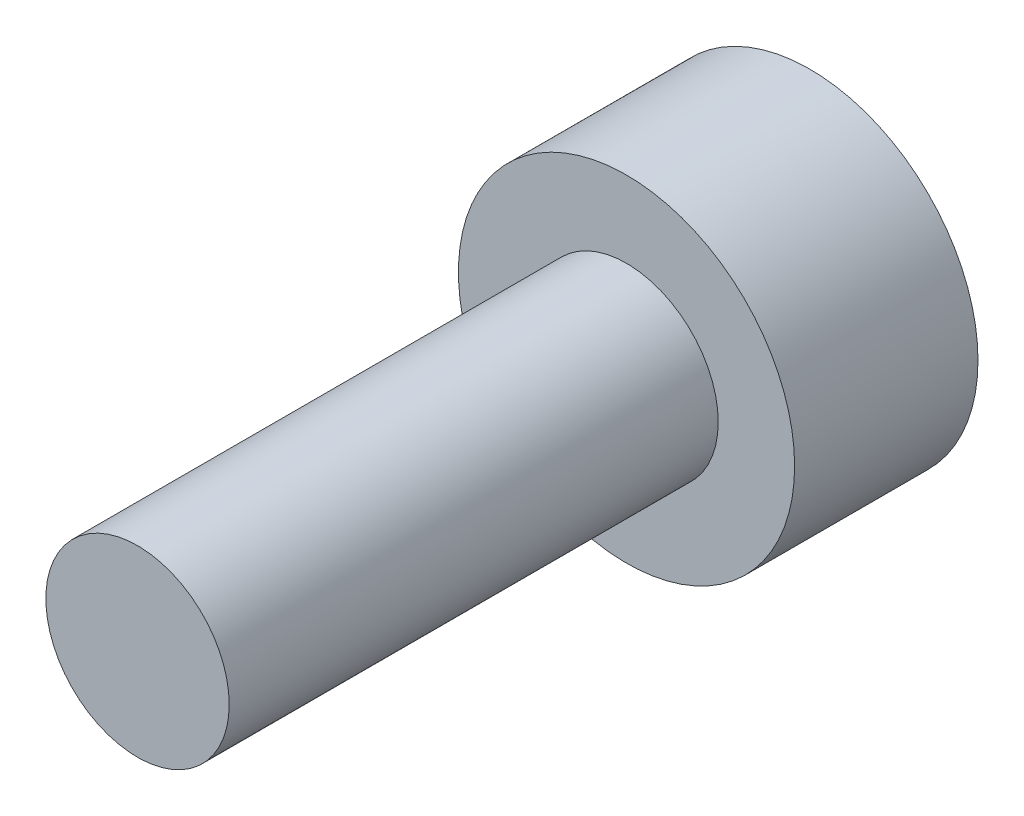
ISO-10303-21;
HEADER;
FILE_DESCRIPTION(('STEP AP214'),'2;1');
FILE_NAME('part.step','',(''),(''),'','','');
FILE_SCHEMA(('AUTOMOTIVE_DESIGN { 1 0 10303 214 1 1 1 1 }'));
ENDSEC;
DATA;
#1=APPLICATION_CONTEXT('core data for automotive mechanical design processes');
#2=APPLICATION_PROTOCOL_DEFINITION('international standard','automotive_design',2000,#1);
#3=PRODUCT_CONTEXT('',#1,'mechanical');
#4=PRODUCT('Part','Part','',(#3));
#5=PRODUCT_RELATED_PRODUCT_CATEGORY('part','',(#4));
#6=PRODUCT_DEFINITION_FORMATION('','',#4);
#7=PRODUCT_DEFINITION_CONTEXT('part definition',#1,'design');
#8=PRODUCT_DEFINITION('design','',#6,#7);
#9=PRODUCT_DEFINITION_SHAPE('','',#8);
#10=(LENGTH_UNIT() NAMED_UNIT(*) SI_UNIT(.MILLI.,.METRE.));
#11=(NAMED_UNIT(*) PLANE_ANGLE_UNIT() SI_UNIT($,.RADIAN.));
#12=(NAMED_UNIT(*) SI_UNIT($,.STERADIAN.) SOLID_ANGLE_UNIT());
#13=UNCERTAINTY_MEASURE_WITH_UNIT(LENGTH_MEASURE(1.E-05),#10,'distance_accuracy_value','');
#14=(GEOMETRIC_REPRESENTATION_CONTEXT(3) GLOBAL_UNCERTAINTY_ASSIGNED_CONTEXT((#13)) GLOBAL_UNIT_ASSIGNED_CONTEXT((#10,
#11,#12)) REPRESENTATION_CONTEXT('',''));
#15=CARTESIAN_POINT('',(0.,0.,0.));
#16=DIRECTION('',(0.,0.,1.));
#17=DIRECTION('',(1.,0.,0.));
#18=AXIS2_PLACEMENT_3D('',#15,#16,#17);
#19=CARTESIAN_POINT('',(0.,0.,3.));
#20=DIRECTION('',(0.,0.,1.));
#21=DIRECTION('',(1.,0.,0.));
#22=AXIS2_PLACEMENT_3D('',#19,#20,#21);
#23=PLANE('',#22);
#24=CARTESIAN_POINT('',(0.,0.,3.));
#25=DIRECTION('',(0.,0.,1.));
#26=DIRECTION('',(1.,0.,0.));
#27=AXIS2_PLACEMENT_3D('',#24,#25,#26);
#28=CIRCLE('',#27,2.75);
#29=CARTESIAN_POINT('',(2.75,0.,3.));
#30=VERTEX_POINT('',#29);
#31=EDGE_CURVE('E11',#30,#30,#28,.T.);
#32=ORIENTED_EDGE('',*,*,#31,.T.);
#33=EDGE_LOOP('',(#32));
#34=FACE_BOUND('',#33,.T.);
#35=CARTESIAN_POINT('',(0.,0.,3.));
#36=DIRECTION('',(0.,0.,1.));
#37=DIRECTION('',(1.,0.,0.));
#38=AXIS2_PLACEMENT_3D('',#35,#36,#37);
#39=CIRCLE('',#38,1.5);
#40=CARTESIAN_POINT('',(1.5,0.,3.));
#41=VERTEX_POINT('',#40);
#42=EDGE_CURVE('E139',#41,#41,#39,.T.);
#43=ORIENTED_EDGE('',*,*,#42,.F.);
#44=EDGE_LOOP('',(#43));
#45=FACE_BOUND('',#44,.T.);
#46=ADVANCED_FACE('F37',(#34,#45),#23,.T.);
#47=CARTESIAN_POINT('',(0.,0.,3.));
#48=DIRECTION('',(0.,0.,-1.));
#49=DIRECTION('',(-1.,0.,0.));
#50=AXIS2_PLACEMENT_3D('',#47,#48,#49);
#51=CYLINDRICAL_SURFACE('',#50,2.75);
#52=ORIENTED_EDGE('',*,*,#31,.F.);
#53=EDGE_LOOP('',(#52));
#54=FACE_BOUND('',#53,.T.);
#55=CARTESIAN_POINT('',(0.,0.,0.));
#56=DIRECTION('',(0.,0.,1.));
#57=DIRECTION('',(1.,0.,0.));
#58=AXIS2_PLACEMENT_3D('',#55,#56,#57);
#59=CIRCLE('',#58,2.75);
#60=CARTESIAN_POINT('',(2.75,0.,0.));
#61=VERTEX_POINT('',#60);
#62=EDGE_CURVE('E41',#61,#61,#59,.T.);
#63=ORIENTED_EDGE('',*,*,#62,.T.);
#64=EDGE_LOOP('',(#63));
#65=FACE_BOUND('',#64,.T.);
#66=ADVANCED_FACE('F39',(#54,#65),#51,.T.);
#67=CARTESIAN_POINT('',(0.,0.,0.));
#68=DIRECTION('',(0.,0.,1.));
#69=DIRECTION('',(1.,0.,0.));
#70=AXIS2_PLACEMENT_3D('',#67,#68,#69);
#71=PLANE('',#70);
#72=DIRECTION('',(0.284171427874139,0.958773487107342,0.));
#73=VECTOR('',#72,1.);
#74=CARTESIAN_POINT('',(-1.66357981000848,-0.399103763087742,0.));
#75=LINE('',#74,#73);
#76=CARTESIAN_POINT('',(-1.66357981000848,-0.399103763087742,0.));
#77=VERTEX_POINT('',#76);
#78=CARTESIAN_POINT('',(-1.17742390258419,1.24115049514637,0.));
#79=VERTEX_POINT('',#78);
#80=EDGE_CURVE('E126',#77,#79,#75,.T.);
#81=ORIENTED_EDGE('',*,*,#80,.F.);
#82=DIRECTION('',(-0.688236482372881,0.725486419122372,0.));
#83=VECTOR('',#82,1.);
#84=CARTESIAN_POINT('',(-0.48615590742429,-1.64025425823411,0.));
#85=LINE('',#84,#83);
#86=CARTESIAN_POINT('',(-0.48615590742429,-1.64025425823411,0.));
#87=VERTEX_POINT('',#86);
#88=EDGE_CURVE('E52',#87,#77,#85,.T.);
#89=ORIENTED_EDGE('',*,*,#88,.F.);
#90=DIRECTION('',(-0.97240791024702,-0.23328706798497,0.));
#91=VECTOR('',#90,1.);
#92=CARTESIAN_POINT('',(1.17742390258419,-1.24115049514637,0.));
#93=LINE('',#92,#91);
#94=CARTESIAN_POINT('',(1.17742390258419,-1.24115049514637,0.));
#95=VERTEX_POINT('',#94);
#96=EDGE_CURVE('E135',#95,#87,#93,.T.);
#97=ORIENTED_EDGE('',*,*,#96,.F.);
#98=DIRECTION('',(-0.284171427874138,-0.958773487107342,0.));
#99=VECTOR('',#98,1.);
#100=CARTESIAN_POINT('',(1.66357981000848,0.399103763087743,0.));
#101=LINE('',#100,#99);
#102=CARTESIAN_POINT('',(1.66357981000848,0.399103763087743,0.));
#103=VERTEX_POINT('',#102);
#104=EDGE_CURVE('E133',#103,#95,#101,.T.);
#105=ORIENTED_EDGE('',*,*,#104,.F.);
#106=DIRECTION('',(0.688236482372881,-0.725486419122372,0.));
#107=VECTOR('',#106,1.);
#108=CARTESIAN_POINT('',(0.486155907424292,1.64025425823411,0.));
#109=LINE('',#108,#107);
#110=CARTESIAN_POINT('',(0.486155907424292,1.64025425823411,0.));
#111=VERTEX_POINT('',#110);
#112=EDGE_CURVE('E100',#111,#103,#109,.T.);
#113=ORIENTED_EDGE('',*,*,#112,.F.);
#114=DIRECTION('',(0.97240791024702,0.23328706798497,0.));
#115=VECTOR('',#114,1.);
#116=CARTESIAN_POINT('',(-1.17742390258419,1.24115049514637,0.));
#117=LINE('',#116,#115);
#118=EDGE_CURVE('E129',#79,#111,#117,.T.);
#119=ORIENTED_EDGE('',*,*,#118,.F.);
#120=EDGE_LOOP('',(#81,#89,#97,#105,#113,#119));
#121=FACE_BOUND('',#120,.T.);
#122=ORIENTED_EDGE('',*,*,#62,.F.);
#123=EDGE_LOOP('',(#122));
#124=FACE_BOUND('',#123,.T.);
#125=ADVANCED_FACE('F159',(#121,#124),#71,.F.);
#126=CARTESIAN_POINT('',(0.,0.,11.));
#127=DIRECTION('',(0.,0.,-1.));
#128=DIRECTION('',(-1.,0.,0.));
#129=AXIS2_PLACEMENT_3D('',#126,#127,#128);
#130=CYLINDRICAL_SURFACE('',#129,1.5);
#131=CARTESIAN_POINT('',(0.,0.,11.));
#132=DIRECTION('',(0.,0.,1.));
#133=DIRECTION('',(1.,0.,0.));
#134=AXIS2_PLACEMENT_3D('',#131,#132,#133);
#135=CIRCLE('',#134,1.5);
#136=CARTESIAN_POINT('',(1.5,0.,11.));
#137=VERTEX_POINT('',#136);
#138=EDGE_CURVE('E145',#137,#137,#135,.T.);
#139=ORIENTED_EDGE('',*,*,#138,.F.);
#140=EDGE_LOOP('',(#139));
#141=FACE_BOUND('',#140,.T.);
#142=ORIENTED_EDGE('',*,*,#42,.T.);
#143=EDGE_LOOP('',(#142));
#144=FACE_BOUND('',#143,.T.);
#145=ADVANCED_FACE('F151',(#141,#144),#130,.T.);
#146=CARTESIAN_POINT('',(0.,0.,11.));
#147=DIRECTION('',(0.,0.,1.));
#148=DIRECTION('',(1.,0.,0.));
#149=AXIS2_PLACEMENT_3D('',#146,#147,#148);
#150=PLANE('',#149);
#151=ORIENTED_EDGE('',*,*,#138,.T.);
#152=EDGE_LOOP('',(#151));
#153=FACE_BOUND('',#152,.T.);
#154=ADVANCED_FACE('F168',(#153),#150,.T.);
#155=CARTESIAN_POINT('',(-0.48615590742429,-1.64025425823411,2.));
#156=DIRECTION('',(-0.725486419122372,-0.688236482372881,0.));
#157=DIRECTION('',(0.688236482372881,-0.725486419122372,0.));
#158=AXIS2_PLACEMENT_3D('',#155,#156,#157);
#159=PLANE('',#158);
#160=ORIENTED_EDGE('',*,*,#88,.T.);
#161=DIRECTION('',(0.,0.,-1.));
#162=VECTOR('',#161,1.);
#163=CARTESIAN_POINT('',(-1.66357981000848,-0.399103763087742,2.));
#164=LINE('',#163,#162);
#165=CARTESIAN_POINT('',(-1.66357981000848,-0.399103763087742,2.));
#166=VERTEX_POINT('',#165);
#167=EDGE_CURVE('E82',#166,#77,#164,.T.);
#168=ORIENTED_EDGE('',*,*,#167,.F.);
#169=DIRECTION('',(-0.688236482372881,0.725486419122372,0.));
#170=VECTOR('',#169,1.);
#171=CARTESIAN_POINT('',(-0.48615590742429,-1.64025425823411,2.));
#172=LINE('',#171,#170);
#173=CARTESIAN_POINT('',(-0.48615590742429,-1.64025425823411,2.));
#174=VERTEX_POINT('',#173);
#175=EDGE_CURVE('E137',#174,#166,#172,.T.);
#176=ORIENTED_EDGE('',*,*,#175,.F.);
#177=DIRECTION('',(0.,0.,-1.));
#178=VECTOR('',#177,1.);
#179=CARTESIAN_POINT('',(-0.48615590742429,-1.64025425823411,2.));
#180=LINE('',#179,#178);
#181=EDGE_CURVE('E60',#174,#87,#180,.T.);
#182=ORIENTED_EDGE('',*,*,#181,.T.);
#183=EDGE_LOOP('',(#160,#168,#176,#182));
#184=FACE_BOUND('',#183,.T.);
#185=ADVANCED_FACE('F180',(#184),#159,.F.);
#186=CARTESIAN_POINT('',(1.17742390258419,-1.24115049514637,2.));
#187=DIRECTION('',(0.23328706798497,-0.97240791024702,0.));
#188=DIRECTION('',(0.97240791024702,0.23328706798497,0.));
#189=AXIS2_PLACEMENT_3D('',#186,#187,#188);
#190=PLANE('',#189);
#191=ORIENTED_EDGE('',*,*,#96,.T.);
#192=ORIENTED_EDGE('',*,*,#181,.F.);
#193=DIRECTION('',(-0.97240791024702,-0.23328706798497,0.));
#194=VECTOR('',#193,1.);
#195=CARTESIAN_POINT('',(1.17742390258419,-1.24115049514637,2.));
#196=LINE('',#195,#194);
#197=CARTESIAN_POINT('',(1.17742390258419,-1.24115049514637,2.));
#198=VERTEX_POINT('',#197);
#199=EDGE_CURVE('E112',#198,#174,#196,.T.);
#200=ORIENTED_EDGE('',*,*,#199,.F.);
#201=DIRECTION('',(0.,0.,-1.));
#202=VECTOR('',#201,1.);
#203=CARTESIAN_POINT('',(1.17742390258419,-1.24115049514637,2.));
#204=LINE('',#203,#202);
#205=EDGE_CURVE('E104',#198,#95,#204,.T.);
#206=ORIENTED_EDGE('',*,*,#205,.T.);
#207=EDGE_LOOP('',(#191,#192,#200,#206));
#208=FACE_BOUND('',#207,.T.);
#209=ADVANCED_FACE('F182',(#208),#190,.F.);
#210=CARTESIAN_POINT('',(1.66357981000848,0.399103763087743,2.));
#211=DIRECTION('',(0.958773487107343,-0.284171427874138,0.));
#212=DIRECTION('',(0.284171427874138,0.958773487107343,0.));
#213=AXIS2_PLACEMENT_3D('',#210,#211,#212);
#214=PLANE('',#213);
#215=ORIENTED_EDGE('',*,*,#104,.T.);
#216=ORIENTED_EDGE('',*,*,#205,.F.);
#217=DIRECTION('',(-0.284171427874138,-0.958773487107342,0.));
#218=VECTOR('',#217,1.);
#219=CARTESIAN_POINT('',(1.66357981000848,0.399103763087743,2.));
#220=LINE('',#219,#218);
#221=CARTESIAN_POINT('',(1.66357981000848,0.399103763087743,2.));
#222=VERTEX_POINT('',#221);
#223=EDGE_CURVE('E108',#222,#198,#220,.T.);
#224=ORIENTED_EDGE('',*,*,#223,.F.);
#225=DIRECTION('',(0.,0.,-1.));
#226=VECTOR('',#225,1.);
#227=CARTESIAN_POINT('',(1.66357981000848,0.399103763087743,2.));
#228=LINE('',#227,#226);
#229=EDGE_CURVE('E93',#222,#103,#228,.T.);
#230=ORIENTED_EDGE('',*,*,#229,.T.);
#231=EDGE_LOOP('',(#215,#216,#224,#230));
#232=FACE_BOUND('',#231,.T.);
#233=ADVANCED_FACE('F109',(#232),#214,.F.);
#234=CARTESIAN_POINT('',(0.486155907424292,1.64025425823411,2.));
#235=DIRECTION('',(0.725486419122372,0.688236482372881,0.));
#236=DIRECTION('',(-0.688236482372881,0.725486419122372,0.));
#237=AXIS2_PLACEMENT_3D('',#234,#235,#236);
#238=PLANE('',#237);
#239=ORIENTED_EDGE('',*,*,#112,.T.);
#240=ORIENTED_EDGE('',*,*,#229,.F.);
#241=DIRECTION('',(0.688236482372881,-0.725486419122372,0.));
#242=VECTOR('',#241,1.);
#243=CARTESIAN_POINT('',(0.486155907424292,1.64025425823411,2.));
#244=LINE('',#243,#242);
#245=CARTESIAN_POINT('',(0.486155907424292,1.64025425823411,2.));
#246=VERTEX_POINT('',#245);
#247=EDGE_CURVE('E97',#246,#222,#244,.T.);
#248=ORIENTED_EDGE('',*,*,#247,.F.);
#249=DIRECTION('',(0.,0.,-1.));
#250=VECTOR('',#249,1.);
#251=CARTESIAN_POINT('',(0.486155907424292,1.64025425823411,2.));
#252=LINE('',#251,#250);
#253=EDGE_CURVE('E105',#246,#111,#252,.T.);
#254=ORIENTED_EDGE('',*,*,#253,.T.);
#255=EDGE_LOOP('',(#239,#240,#248,#254));
#256=FACE_BOUND('',#255,.T.);
#257=ADVANCED_FACE('F95',(#256),#238,.F.);
#258=CARTESIAN_POINT('',(-1.17742390258419,1.24115049514637,2.));
#259=DIRECTION('',(-0.23328706798497,0.97240791024702,0.));
#260=DIRECTION('',(-0.97240791024702,-0.23328706798497,0.));
#261=AXIS2_PLACEMENT_3D('',#258,#259,#260);
#262=PLANE('',#261);
#263=ORIENTED_EDGE('',*,*,#118,.T.);
#264=ORIENTED_EDGE('',*,*,#253,.F.);
#265=DIRECTION('',(0.97240791024702,0.23328706798497,0.));
#266=VECTOR('',#265,1.);
#267=CARTESIAN_POINT('',(-1.17742390258419,1.24115049514637,2.));
#268=LINE('',#267,#266);
#269=CARTESIAN_POINT('',(-1.17742390258419,1.24115049514637,2.));
#270=VERTEX_POINT('',#269);
#271=EDGE_CURVE('E118',#270,#246,#268,.T.);
#272=ORIENTED_EDGE('',*,*,#271,.F.);
#273=DIRECTION('',(0.,0.,-1.));
#274=VECTOR('',#273,1.);
#275=CARTESIAN_POINT('',(-1.17742390258419,1.24115049514637,2.));
#276=LINE('',#275,#274);
#277=EDGE_CURVE('E142',#270,#79,#276,.T.);
#278=ORIENTED_EDGE('',*,*,#277,.T.);
#279=EDGE_LOOP('',(#263,#264,#272,#278));
#280=FACE_BOUND('',#279,.T.);
#281=ADVANCED_FACE('F193',(#280),#262,.F.);
#282=CARTESIAN_POINT('',(-1.66357981000848,-0.399103763087742,2.));
#283=DIRECTION('',(-0.958773487107342,0.284171427874139,0.));
#284=DIRECTION('',(-0.284171427874139,-0.958773487107342,0.));
#285=AXIS2_PLACEMENT_3D('',#282,#283,#284);
#286=PLANE('',#285);
#287=ORIENTED_EDGE('',*,*,#80,.T.);
#288=ORIENTED_EDGE('',*,*,#277,.F.);
#289=DIRECTION('',(0.284171427874139,0.958773487107342,0.));
#290=VECTOR('',#289,1.);
#291=CARTESIAN_POINT('',(-1.66357981000848,-0.399103763087742,2.));
#292=LINE('',#291,#290);
#293=EDGE_CURVE('E120',#166,#270,#292,.T.);
#294=ORIENTED_EDGE('',*,*,#293,.F.);
#295=ORIENTED_EDGE('',*,*,#167,.T.);
#296=EDGE_LOOP('',(#287,#288,#294,#295));
#297=FACE_BOUND('',#296,.T.);
#298=ADVANCED_FACE('F178',(#297),#286,.F.);
#299=CARTESIAN_POINT('',(0.,0.,2.));
#300=DIRECTION('',(0.,0.,-1.));
#301=DIRECTION('',(-1.,0.,0.));
#302=AXIS2_PLACEMENT_3D('',#299,#300,#301);
#303=PLANE('',#302);
#304=ORIENTED_EDGE('',*,*,#175,.T.);
#305=ORIENTED_EDGE('',*,*,#293,.T.);
#306=ORIENTED_EDGE('',*,*,#271,.T.);
#307=ORIENTED_EDGE('',*,*,#247,.T.);
#308=ORIENTED_EDGE('',*,*,#223,.T.);
#309=ORIENTED_EDGE('',*,*,#199,.T.);
#310=EDGE_LOOP('',(#304,#305,#306,#307,#308,#309));
#311=FACE_BOUND('',#310,.T.);
#312=ADVANCED_FACE('F115',(#311),#303,.T.);
#313=CLOSED_SHELL('',(#46,#66,#125,#145,#154,#185,#209,#233,#257,#281,#298,#312));
#314=MANIFOLD_SOLID_BREP('B2',#313);
#315=ADVANCED_BREP_SHAPE_REPRESENTATION('',(#18,#314),#14);
#316=SHAPE_DEFINITION_REPRESENTATION(#9,#315);
ENDSEC;
END-ISO-10303-21;
